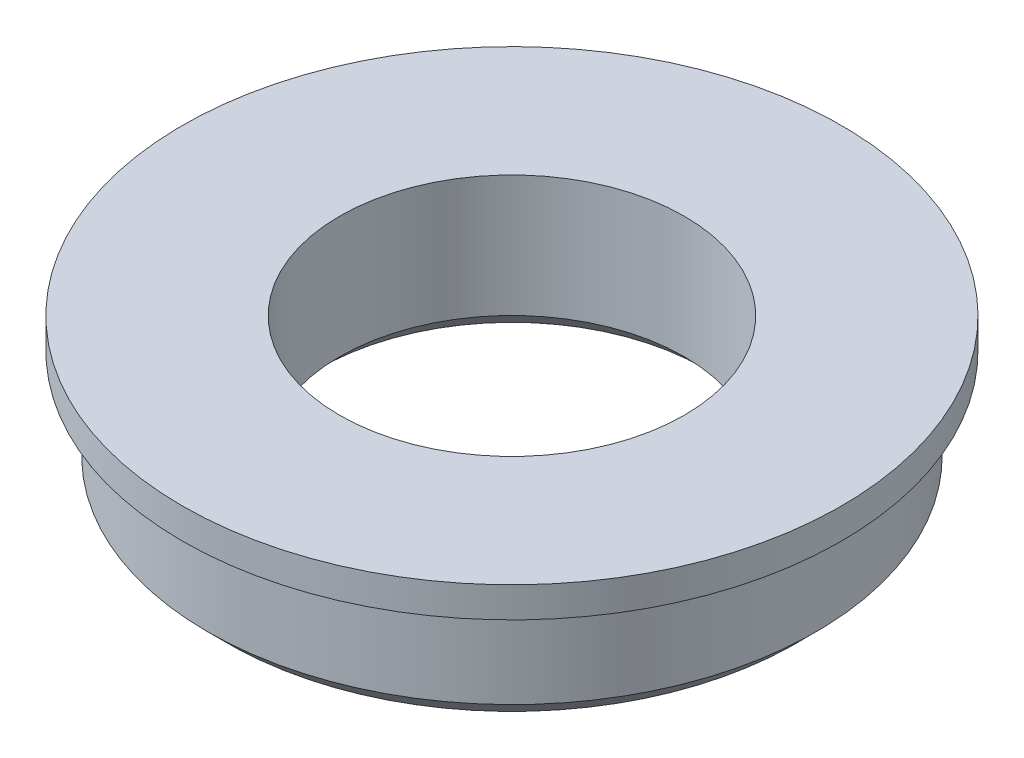
ISO-10303-21;
HEADER;
FILE_DESCRIPTION(('STEP AP214'),'2;1');
FILE_NAME('part.step','',(''),(''),'','','');
FILE_SCHEMA(('AUTOMOTIVE_DESIGN { 1 0 10303 214 1 1 1 1 }'));
ENDSEC;
DATA;
#1=APPLICATION_CONTEXT('core data for automotive mechanical design processes');
#2=APPLICATION_PROTOCOL_DEFINITION('international standard','automotive_design',2000,#1);
#3=PRODUCT_CONTEXT('',#1,'mechanical');
#4=PRODUCT('Part','Part','',(#3));
#5=PRODUCT_RELATED_PRODUCT_CATEGORY('part','',(#4));
#6=PRODUCT_DEFINITION_FORMATION('','',#4);
#7=PRODUCT_DEFINITION_CONTEXT('part definition',#1,'design');
#8=PRODUCT_DEFINITION('design','',#6,#7);
#9=PRODUCT_DEFINITION_SHAPE('','',#8);
#10=(LENGTH_UNIT() NAMED_UNIT(*) SI_UNIT(.MILLI.,.METRE.));
#11=(NAMED_UNIT(*) PLANE_ANGLE_UNIT() SI_UNIT($,.RADIAN.));
#12=(NAMED_UNIT(*) SI_UNIT($,.STERADIAN.) SOLID_ANGLE_UNIT());
#13=UNCERTAINTY_MEASURE_WITH_UNIT(LENGTH_MEASURE(1.E-05),#10,'distance_accuracy_value','');
#14=(GEOMETRIC_REPRESENTATION_CONTEXT(3) GLOBAL_UNCERTAINTY_ASSIGNED_CONTEXT((#13)) GLOBAL_UNIT_ASSIGNED_CONTEXT((#10,
#11,#12)) REPRESENTATION_CONTEXT('',''));
#15=CARTESIAN_POINT('',(0.,0.,0.));
#16=DIRECTION('',(0.,0.,1.));
#17=DIRECTION('',(1.,0.,0.));
#18=AXIS2_PLACEMENT_3D('',#15,#16,#17);
#19=CARTESIAN_POINT('',(0.,46.2297530920181,0.));
#20=DIRECTION('',(0.,1.,0.));
#21=DIRECTION('',(0.,0.,1.));
#22=AXIS2_PLACEMENT_3D('',#19,#20,#21);
#23=CYLINDRICAL_SURFACE('',#22,8.5);
#24=CARTESIAN_POINT('',(0.,1.,0.));
#25=DIRECTION('',(0.,-1.,0.));
#26=DIRECTION('',(0.,0.,-1.));
#27=AXIS2_PLACEMENT_3D('',#24,#25,#26);
#28=CIRCLE('',#27,8.5);
#29=CARTESIAN_POINT('',(0.,1.,-8.5));
#30=VERTEX_POINT('',#29);
#31=EDGE_CURVE('E40',#30,#30,#28,.T.);
#32=ORIENTED_EDGE('',*,*,#31,.T.);
#33=EDGE_LOOP('',(#32));
#34=FACE_BOUND('',#33,.T.);
#35=CARTESIAN_POINT('',(0.,7.,0.));
#36=DIRECTION('',(0.,1.,0.));
#37=DIRECTION('',(0.,0.,1.));
#38=AXIS2_PLACEMENT_3D('',#35,#36,#37);
#39=CIRCLE('',#38,8.49999999999999);
#40=CARTESIAN_POINT('',(0.,7.,8.49999999999999));
#41=VERTEX_POINT('',#40);
#42=EDGE_CURVE('E62',#41,#41,#39,.T.);
#43=ORIENTED_EDGE('',*,*,#42,.T.);
#44=EDGE_LOOP('',(#43));
#45=FACE_BOUND('',#44,.T.);
#46=ADVANCED_FACE('F33',(#34,#45),#23,.F.);
#47=CARTESIAN_POINT('',(-8.5,0.,0.));
#48=DIRECTION('',(0.,-1.,0.));
#49=DIRECTION('',(0.,0.,-1.));
#50=AXIS2_PLACEMENT_3D('',#47,#48,#49);
#51=PLANE('',#50);
#52=CARTESIAN_POINT('',(0.,0.,0.));
#53=DIRECTION('',(0.,-1.,0.));
#54=DIRECTION('',(0.,0.,-1.));
#55=AXIS2_PLACEMENT_3D('',#52,#53,#54);
#56=CIRCLE('',#55,9.49999999999999);
#57=CARTESIAN_POINT('',(0.,0.,-9.49999999999999));
#58=VERTEX_POINT('',#57);
#59=EDGE_CURVE('E44',#58,#58,#56,.F.);
#60=ORIENTED_EDGE('',*,*,#59,.T.);
#61=EDGE_LOOP('',(#60));
#62=FACE_BOUND('',#61,.T.);
#63=CARTESIAN_POINT('',(0.,0.,0.));
#64=DIRECTION('',(0.,-1.,0.));
#65=DIRECTION('',(0.,0.,-1.));
#66=AXIS2_PLACEMENT_3D('',#63,#64,#65);
#67=CIRCLE('',#66,14.);
#68=CARTESIAN_POINT('',(0.,0.,-14.));
#69=VERTEX_POINT('',#68);
#70=EDGE_CURVE('E48',#69,#69,#67,.T.);
#71=ORIENTED_EDGE('',*,*,#70,.T.);
#72=EDGE_LOOP('',(#71));
#73=FACE_BOUND('',#72,.T.);
#74=ADVANCED_FACE('F82',(#62,#73),#51,.T.);
#75=CARTESIAN_POINT('',(0.,46.2297530920181,0.));
#76=DIRECTION('',(0.,1.,0.));
#77=DIRECTION('',(0.,0.,1.));
#78=AXIS2_PLACEMENT_3D('',#75,#76,#77);
#79=CYLINDRICAL_SURFACE('',#78,15.);
#80=CARTESIAN_POINT('',(0.,0.999999999999994,0.));
#81=DIRECTION('',(0.,-1.,0.));
#82=DIRECTION('',(0.,0.,-1.));
#83=AXIS2_PLACEMENT_3D('',#80,#81,#82);
#84=CIRCLE('',#83,15.);
#85=CARTESIAN_POINT('',(0.,0.999999999999994,-15.));
#86=VERTEX_POINT('',#85);
#87=EDGE_CURVE('E10',#86,#86,#84,.F.);
#88=ORIENTED_EDGE('',*,*,#87,.T.);
#89=EDGE_LOOP('',(#88));
#90=FACE_BOUND('',#89,.T.);
#91=CARTESIAN_POINT('',(0.,5.5,0.));
#92=DIRECTION('',(0.,1.,0.));
#93=DIRECTION('',(0.,0.,1.));
#94=AXIS2_PLACEMENT_3D('',#91,#92,#93);
#95=CIRCLE('',#94,15.);
#96=CARTESIAN_POINT('',(0.,5.5,15.));
#97=VERTEX_POINT('',#96);
#98=EDGE_CURVE('E53',#97,#97,#95,.T.);
#99=ORIENTED_EDGE('',*,*,#98,.F.);
#100=EDGE_LOOP('',(#99));
#101=FACE_BOUND('',#100,.T.);
#102=ADVANCED_FACE('F87',(#90,#101),#79,.T.);
#103=CARTESIAN_POINT('',(-15.,5.5,0.));
#104=DIRECTION('',(0.,-1.,0.));
#105=DIRECTION('',(0.,0.,-1.));
#106=AXIS2_PLACEMENT_3D('',#103,#104,#105);
#107=PLANE('',#106);
#108=ORIENTED_EDGE('',*,*,#98,.T.);
#109=EDGE_LOOP('',(#108));
#110=FACE_BOUND('',#109,.T.);
#111=CARTESIAN_POINT('',(0.,5.5,0.));
#112=DIRECTION('',(0.,1.,0.));
#113=DIRECTION('',(0.,0.,1.));
#114=AXIS2_PLACEMENT_3D('',#111,#112,#113);
#115=CIRCLE('',#114,16.25);
#116=CARTESIAN_POINT('',(0.,5.5,16.25));
#117=VERTEX_POINT('',#116);
#118=EDGE_CURVE('E56',#117,#117,#115,.T.);
#119=ORIENTED_EDGE('',*,*,#118,.F.);
#120=EDGE_LOOP('',(#119));
#121=FACE_BOUND('',#120,.T.);
#122=ADVANCED_FACE('F78',(#110,#121),#107,.T.);
#123=CARTESIAN_POINT('',(0.,46.2297530920181,0.));
#124=DIRECTION('',(0.,1.,0.));
#125=DIRECTION('',(0.,0.,1.));
#126=AXIS2_PLACEMENT_3D('',#123,#124,#125);
#127=CYLINDRICAL_SURFACE('',#126,16.25);
#128=ORIENTED_EDGE('',*,*,#118,.T.);
#129=EDGE_LOOP('',(#128));
#130=FACE_BOUND('',#129,.T.);
#131=CARTESIAN_POINT('',(0.,7.,0.));
#132=DIRECTION('',(0.,1.,0.));
#133=DIRECTION('',(0.,0.,1.));
#134=AXIS2_PLACEMENT_3D('',#131,#132,#133);
#135=CIRCLE('',#134,16.25);
#136=CARTESIAN_POINT('',(0.,7.,16.25));
#137=VERTEX_POINT('',#136);
#138=EDGE_CURVE('E59',#137,#137,#135,.T.);
#139=ORIENTED_EDGE('',*,*,#138,.F.);
#140=EDGE_LOOP('',(#139));
#141=FACE_BOUND('',#140,.T.);
#142=ADVANCED_FACE('F70',(#130,#141),#127,.T.);
#143=CARTESIAN_POINT('',(-16.25,7.,0.));
#144=DIRECTION('',(0.,1.,0.));
#145=DIRECTION('',(0.,0.,1.));
#146=AXIS2_PLACEMENT_3D('',#143,#144,#145);
#147=PLANE('',#146);
#148=ORIENTED_EDGE('',*,*,#138,.T.);
#149=EDGE_LOOP('',(#148));
#150=FACE_BOUND('',#149,.T.);
#151=ORIENTED_EDGE('',*,*,#42,.F.);
#152=EDGE_LOOP('',(#151));
#153=FACE_BOUND('',#152,.T.);
#154=ADVANCED_FACE('F67',(#150,#153),#147,.T.);
#155=CARTESIAN_POINT('',(0.,0.,0.));
#156=DIRECTION('',(0.,-1.,0.));
#157=DIRECTION('',(0.,0.,-1.));
#158=AXIS2_PLACEMENT_3D('',#155,#156,#157);
#159=CONICAL_SURFACE('',#158,9.49999999999999,0.785398163397445);
#160=ORIENTED_EDGE('',*,*,#31,.F.);
#161=EDGE_LOOP('',(#160));
#162=FACE_BOUND('',#161,.T.);
#163=ORIENTED_EDGE('',*,*,#59,.F.);
#164=EDGE_LOOP('',(#163));
#165=FACE_BOUND('',#164,.T.);
#166=ADVANCED_FACE('F69',(#162,#165),#159,.F.);
#167=CARTESIAN_POINT('',(0.,0.999999999999994,0.));
#168=DIRECTION('',(0.,1.,0.));
#169=DIRECTION('',(0.,0.,1.));
#170=AXIS2_PLACEMENT_3D('',#167,#168,#169);
#171=CONICAL_SURFACE('',#170,15.,0.785398163397453);
#172=ORIENTED_EDGE('',*,*,#70,.F.);
#173=EDGE_LOOP('',(#172));
#174=FACE_BOUND('',#173,.T.);
#175=ORIENTED_EDGE('',*,*,#87,.F.);
#176=EDGE_LOOP('',(#175));
#177=FACE_BOUND('',#176,.T.);
#178=ADVANCED_FACE('F35',(#174,#177),#171,.T.);
#179=CLOSED_SHELL('',(#46,#74,#102,#122,#142,#154,#166,#178));
#180=MANIFOLD_SOLID_BREP('B2',#179);
#181=ADVANCED_BREP_SHAPE_REPRESENTATION('',(#18,#180),#14);
#182=SHAPE_DEFINITION_REPRESENTATION(#9,#181);
ENDSEC;
END-ISO-10303-21;
